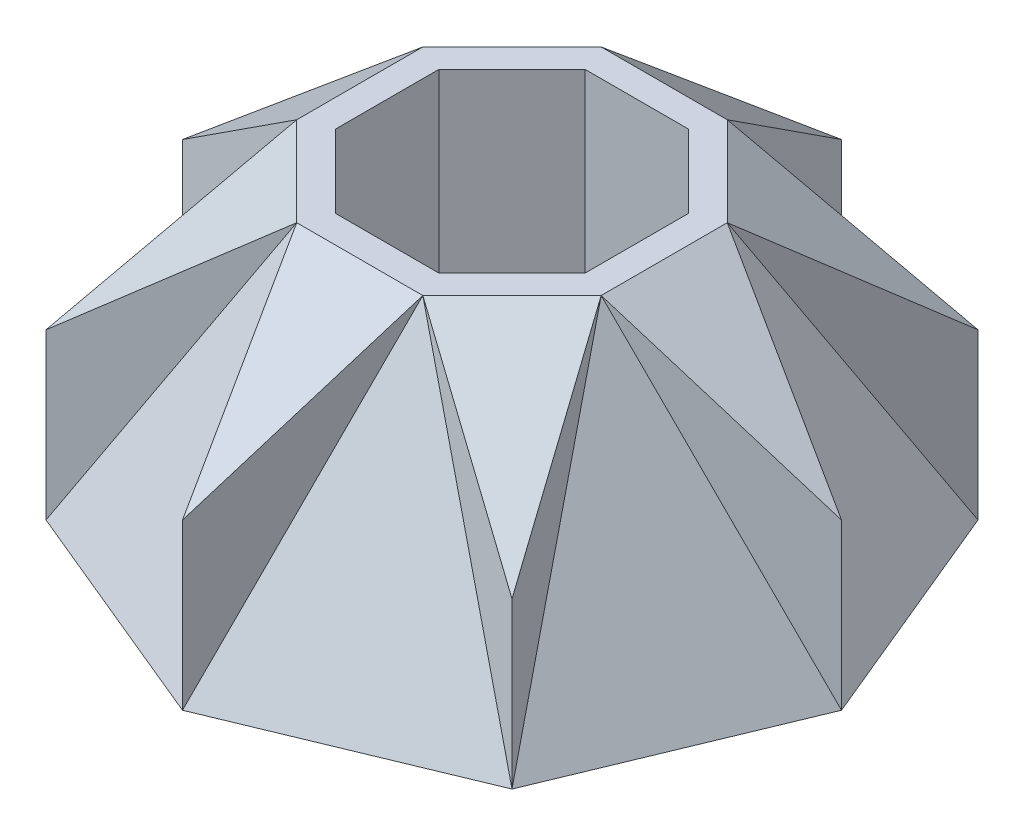
ISO-10303-21;
HEADER;
FILE_DESCRIPTION(('STEP AP214'),'2;1');
FILE_NAME('part.step','',(''),(''),'','','');
FILE_SCHEMA(('AUTOMOTIVE_DESIGN { 1 0 10303 214 1 1 1 1 }'));
ENDSEC;
DATA;
#1=APPLICATION_CONTEXT('core data for automotive mechanical design processes');
#2=APPLICATION_PROTOCOL_DEFINITION('international standard','automotive_design',2000,#1);
#3=PRODUCT_CONTEXT('',#1,'mechanical');
#4=PRODUCT('Part','Part','',(#3));
#5=PRODUCT_RELATED_PRODUCT_CATEGORY('part','',(#4));
#6=PRODUCT_DEFINITION_FORMATION('','',#4);
#7=PRODUCT_DEFINITION_CONTEXT('part definition',#1,'design');
#8=PRODUCT_DEFINITION('design','',#6,#7);
#9=PRODUCT_DEFINITION_SHAPE('','',#8);
#10=(LENGTH_UNIT() NAMED_UNIT(*) SI_UNIT(.MILLI.,.METRE.));
#11=(NAMED_UNIT(*) PLANE_ANGLE_UNIT() SI_UNIT($,.RADIAN.));
#12=(NAMED_UNIT(*) SI_UNIT($,.STERADIAN.) SOLID_ANGLE_UNIT());
#13=UNCERTAINTY_MEASURE_WITH_UNIT(LENGTH_MEASURE(1.E-05),#10,'distance_accuracy_value','');
#14=(GEOMETRIC_REPRESENTATION_CONTEXT(3) GLOBAL_UNCERTAINTY_ASSIGNED_CONTEXT((#13)) GLOBAL_UNIT_ASSIGNED_CONTEXT((#10,
#11,#12)) REPRESENTATION_CONTEXT('',''));
#15=CARTESIAN_POINT('',(0.,0.,0.));
#16=DIRECTION('',(0.,0.,1.));
#17=DIRECTION('',(1.,0.,0.));
#18=AXIS2_PLACEMENT_3D('',#15,#16,#17);
#19=CARTESIAN_POINT('',(0.,0.,0.));
#20=DIRECTION('',(0.,1.,0.));
#21=DIRECTION('',(0.,0.,1.));
#22=AXIS2_PLACEMENT_3D('',#19,#20,#21);
#23=PLANE('',#22);
#24=DIRECTION('',(1.,0.,0.));
#25=VECTOR('',#24,1.);
#26=CARTESIAN_POINT('',(11.4805029709524,0.,27.7163859753387));
#27=LINE('',#26,#25);
#28=CARTESIAN_POINT('',(-11.480502970953,0.,27.7163859753385));
#29=VERTEX_POINT('',#28);
#30=CARTESIAN_POINT('',(11.4805029709524,0.,27.7163859753387));
#31=VERTEX_POINT('',#30);
#32=EDGE_CURVE('E413',#29,#31,#27,.T.);
#33=ORIENTED_EDGE('',*,*,#32,.T.);
#34=DIRECTION('',(0.707106781186554,0.,-0.707106781186541));
#35=VECTOR('',#34,1.);
#36=CARTESIAN_POINT('',(27.7163859753385,0.,11.4805029709529));
#37=LINE('',#36,#35);
#38=CARTESIAN_POINT('',(27.7163859753386,0.,11.4805029709527));
#39=VERTEX_POINT('',#38);
#40=EDGE_CURVE('E337',#31,#39,#37,.T.);
#41=ORIENTED_EDGE('',*,*,#40,.T.);
#42=DIRECTION('',(0.,0.,-1.));
#43=VECTOR('',#42,1.);
#44=CARTESIAN_POINT('',(27.7163859753386,0.,-11.4805029709527));
#45=LINE('',#44,#43);
#46=CARTESIAN_POINT('',(27.7163859753386,0.,-11.4805029709525));
#47=VERTEX_POINT('',#46);
#48=EDGE_CURVE('E396',#39,#47,#45,.T.);
#49=ORIENTED_EDGE('',*,*,#48,.T.);
#50=DIRECTION('',(-0.707106781186544,0.,-0.707106781186551));
#51=VECTOR('',#50,1.);
#52=CARTESIAN_POINT('',(11.4805029709528,0.,-27.7163859753385));
#53=LINE('',#52,#51);
#54=CARTESIAN_POINT('',(11.4805029709528,0.,-27.7163859753385));
#55=VERTEX_POINT('',#54);
#56=EDGE_CURVE('E332',#47,#55,#53,.T.);
#57=ORIENTED_EDGE('',*,*,#56,.T.);
#58=DIRECTION('',(-1.,0.,0.));
#59=VECTOR('',#58,1.);
#60=CARTESIAN_POINT('',(-11.4805029709526,0.,-27.7163859753386));
#61=LINE('',#60,#59);
#62=CARTESIAN_POINT('',(-11.4805029709526,0.,-27.7163859753386));
#63=VERTEX_POINT('',#62);
#64=EDGE_CURVE('E347',#55,#63,#61,.T.);
#65=ORIENTED_EDGE('',*,*,#64,.T.);
#66=DIRECTION('',(-0.707106781186549,0.,0.707106781186546));
#67=VECTOR('',#66,1.);
#68=CARTESIAN_POINT('',(-27.7163859753386,0.,-11.4805029709527));
#69=LINE('',#68,#67);
#70=CARTESIAN_POINT('',(-27.7163859753386,0.,-11.4805029709527));
#71=VERTEX_POINT('',#70);
#72=EDGE_CURVE('E105',#63,#71,#69,.T.);
#73=ORIENTED_EDGE('',*,*,#72,.T.);
#74=DIRECTION('',(0.,0.,1.));
#75=VECTOR('',#74,1.);
#76=CARTESIAN_POINT('',(-27.7163859753386,0.,11.4805029709527));
#77=LINE('',#76,#75);
#78=CARTESIAN_POINT('',(-27.7163859753387,0.,11.4805029709524));
#79=VERTEX_POINT('',#78);
#80=EDGE_CURVE('E203',#71,#79,#77,.T.);
#81=ORIENTED_EDGE('',*,*,#80,.T.);
#82=DIRECTION('',(0.707106781186539,0.,0.707106781186556));
#83=VECTOR('',#82,1.);
#84=CARTESIAN_POINT('',(-11.480502970953,0.,27.7163859753384));
#85=LINE('',#84,#83);
#86=EDGE_CURVE('E342',#79,#29,#85,.T.);
#87=ORIENTED_EDGE('',*,*,#86,.T.);
#88=EDGE_LOOP('',(#33,#41,#49,#57,#65,#73,#81,#87));
#89=FACE_BOUND('',#88,.T.);
#90=DIRECTION('',(0.707106781186548,0.,0.707106781186548));
#91=VECTOR('',#90,1.);
#92=CARTESIAN_POINT('',(-16.0629105672129,0.,16.0629105672129));
#93=LINE('',#92,#91);
#94=CARTESIAN_POINT('',(-22.7163859753386,0.,9.40943515908722));
#95=VERTEX_POINT('',#94);
#96=CARTESIAN_POINT('',(-9.40943515908721,0.,22.7163859753386));
#97=VERTEX_POINT('',#96);
#98=EDGE_CURVE('E199',#95,#97,#93,.T.);
#99=ORIENTED_EDGE('',*,*,#98,.F.);
#100=DIRECTION('',(0.,0.,1.));
#101=VECTOR('',#100,1.);
#102=CARTESIAN_POINT('',(-22.7163859753386,0.,0.));
#103=LINE('',#102,#101);
#104=CARTESIAN_POINT('',(-22.7163859753386,0.,-9.40943515908721));
#105=VERTEX_POINT('',#104);
#106=EDGE_CURVE('E202',#105,#95,#103,.T.);
#107=ORIENTED_EDGE('',*,*,#106,.F.);
#108=DIRECTION('',(-0.707106781186548,0.,0.707106781186548));
#109=VECTOR('',#108,1.);
#110=CARTESIAN_POINT('',(-16.0629105672129,0.,-16.0629105672129));
#111=LINE('',#110,#109);
#112=CARTESIAN_POINT('',(-9.40943515908721,0.,-22.7163859753386));
#113=VERTEX_POINT('',#112);
#114=EDGE_CURVE('E205',#113,#105,#111,.T.);
#115=ORIENTED_EDGE('',*,*,#114,.F.);
#116=DIRECTION('',(-1.,0.,0.));
#117=VECTOR('',#116,1.);
#118=CARTESIAN_POINT('',(0.,0.,-22.7163859753386));
#119=LINE('',#118,#117);
#120=CARTESIAN_POINT('',(9.40943515908723,0.,-22.7163859753386));
#121=VERTEX_POINT('',#120);
#122=EDGE_CURVE('E207',#121,#113,#119,.T.);
#123=ORIENTED_EDGE('',*,*,#122,.F.);
#124=DIRECTION('',(-0.707106781186548,0.,-0.707106781186547));
#125=VECTOR('',#124,1.);
#126=CARTESIAN_POINT('',(16.0629105672129,0.,-16.0629105672129));
#127=LINE('',#126,#125);
#128=CARTESIAN_POINT('',(22.7163859753386,0.,-9.40943515908722));
#129=VERTEX_POINT('',#128);
#130=EDGE_CURVE('E209',#129,#121,#127,.T.);
#131=ORIENTED_EDGE('',*,*,#130,.F.);
#132=DIRECTION('',(0.,0.,-1.));
#133=VECTOR('',#132,1.);
#134=CARTESIAN_POINT('',(22.7163859753386,0.,0.));
#135=LINE('',#134,#133);
#136=CARTESIAN_POINT('',(22.7163859753386,0.,9.40943515908721));
#137=VERTEX_POINT('',#136);
#138=EDGE_CURVE('E211',#137,#129,#135,.T.);
#139=ORIENTED_EDGE('',*,*,#138,.F.);
#140=DIRECTION('',(0.707106781186548,0.,-0.707106781186548));
#141=VECTOR('',#140,1.);
#142=CARTESIAN_POINT('',(16.0629105672129,0.,16.0629105672129));
#143=LINE('',#142,#141);
#144=CARTESIAN_POINT('',(9.40943515908722,0.,22.7163859753386));
#145=VERTEX_POINT('',#144);
#146=EDGE_CURVE('E182',#145,#137,#143,.T.);
#147=ORIENTED_EDGE('',*,*,#146,.F.);
#148=DIRECTION('',(1.,0.,0.));
#149=VECTOR('',#148,1.);
#150=CARTESIAN_POINT('',(0.,0.,22.7163859753386));
#151=LINE('',#150,#149);
#152=EDGE_CURVE('E147',#97,#145,#151,.T.);
#153=ORIENTED_EDGE('',*,*,#152,.F.);
#154=EDGE_LOOP('',(#99,#107,#115,#123,#131,#139,#147,#153));
#155=FACE_BOUND('',#154,.T.);
#156=ADVANCED_FACE('F88',(#89,#155),#23,.T.);
#157=CARTESIAN_POINT('',(9.45810682098834,11.4286665506786,22.8338897616031));
#158=DIRECTION('',(0.347345206863505,0.419713228276339,0.838565509235148));
#159=DIRECTION('',(0.,-0.89424349333012,0.447580802354998));
#160=AXIS2_PLACEMENT_3D('',#157,#158,#159);
#161=PLANE('',#160);
#162=DIRECTION('',(0.177168388990801,0.848766070541331,-0.498204294883367));
#163=VECTOR('',#162,1.);
#164=CARTESIAN_POINT('',(13.5665615928986,9.99374543931796,21.850309240363));
#165=LINE('',#164,#163);
#166=CARTESIAN_POINT('',(-6.21527747087855E-13,-55.,59.9999999999999));
#167=VERTEX_POINT('',#166);
#168=EDGE_CURVE('E435',#167,#31,#165,.T.);
#169=ORIENTED_EDGE('',*,*,#168,.F.);
#170=DIRECTION('',(0.923879532511284,0.,-0.382683432365096));
#171=VECTOR('',#170,1.);
#172=CARTESIAN_POINT('',(21.2132034355967,-55.,51.2132034355963));
#173=LINE('',#172,#171);
#174=CARTESIAN_POINT('',(42.4264068711927,-55.,42.4264068711927));
#175=VERTEX_POINT('',#174);
#176=EDGE_CURVE('E215',#167,#175,#173,.T.);
#177=ORIENTED_EDGE('',*,*,#176,.T.);
#178=DIRECTION('',(0.477560604595568,-0.848766070541338,0.227006666061004));
#179=VECTOR('',#178,1.);
#180=CARTESIAN_POINT('',(5.85749413515997,9.99374543931783,25.0435095346075));
#181=LINE('',#180,#179);
#182=EDGE_CURVE('E469',#31,#175,#181,.T.);
#183=ORIENTED_EDGE('',*,*,#182,.F.);
#184=EDGE_LOOP('',(#169,#177,#183));
#185=FACE_BOUND('',#184,.T.);
#186=ADVANCED_FACE('F619',(#185),#161,.T.);
#187=CARTESIAN_POINT('',(-16.0629105672129,-55.,16.0629105672129));
#188=DIRECTION('',(-0.707106781186548,0.,0.707106781186548));
#189=DIRECTION('',(0.707106781186548,0.,0.707106781186548));
#190=AXIS2_PLACEMENT_3D('',#187,#188,#189);
#191=PLANE('',#190);
#192=ORIENTED_EDGE('',*,*,#98,.T.);
#193=DIRECTION('',(0.,1.,0.));
#194=VECTOR('',#193,1.);
#195=CARTESIAN_POINT('',(-9.40943515908721,-55.,22.7163859753386));
#196=LINE('',#195,#194);
#197=CARTESIAN_POINT('',(-9.40943515908721,-55.,22.7163859753386));
#198=VERTEX_POINT('',#197);
#199=EDGE_CURVE('E216',#198,#97,#196,.T.);
#200=ORIENTED_EDGE('',*,*,#199,.F.);
#201=DIRECTION('',(0.707106781186548,0.,0.707106781186548));
#202=VECTOR('',#201,1.);
#203=CARTESIAN_POINT('',(-16.0629105672129,-55.,16.0629105672129));
#204=LINE('',#203,#202);
#205=CARTESIAN_POINT('',(-22.7163859753386,-55.,9.40943515908722));
#206=VERTEX_POINT('',#205);
#207=EDGE_CURVE('E327',#206,#198,#204,.T.);
#208=ORIENTED_EDGE('',*,*,#207,.F.);
#209=DIRECTION('',(0.,1.,0.));
#210=VECTOR('',#209,1.);
#211=CARTESIAN_POINT('',(-22.7163859753386,-55.,9.40943515908722));
#212=LINE('',#211,#210);
#213=EDGE_CURVE('E198',#206,#95,#212,.T.);
#214=ORIENTED_EDGE('',*,*,#213,.T.);
#215=EDGE_LOOP('',(#192,#200,#208,#214));
#216=FACE_BOUND('',#215,.T.);
#217=ADVANCED_FACE('F90',(#216),#191,.F.);
#218=CARTESIAN_POINT('',(0.,-55.,22.7163859753386));
#219=DIRECTION('',(0.,0.,1.));
#220=DIRECTION('',(1.,0.,0.));
#221=AXIS2_PLACEMENT_3D('',#218,#219,#220);
#222=PLANE('',#221);
#223=ORIENTED_EDGE('',*,*,#152,.T.);
#224=DIRECTION('',(0.,1.,0.));
#225=VECTOR('',#224,1.);
#226=CARTESIAN_POINT('',(9.40943515908722,-55.,22.7163859753386));
#227=LINE('',#226,#225);
#228=CARTESIAN_POINT('',(9.40943515908722,-55.,22.7163859753386));
#229=VERTEX_POINT('',#228);
#230=EDGE_CURVE('E185',#229,#145,#227,.T.);
#231=ORIENTED_EDGE('',*,*,#230,.F.);
#232=DIRECTION('',(1.,0.,0.));
#233=VECTOR('',#232,1.);
#234=CARTESIAN_POINT('',(0.,-55.,22.7163859753386));
#235=LINE('',#234,#233);
#236=EDGE_CURVE('E114',#198,#229,#235,.T.);
#237=ORIENTED_EDGE('',*,*,#236,.F.);
#238=ORIENTED_EDGE('',*,*,#199,.T.);
#239=EDGE_LOOP('',(#223,#231,#237,#238));
#240=FACE_BOUND('',#239,.T.);
#241=ADVANCED_FACE('F628',(#240),#222,.F.);
#242=CARTESIAN_POINT('',(16.0629105672129,-55.,16.0629105672129));
#243=DIRECTION('',(0.707106781186548,0.,0.707106781186548));
#244=DIRECTION('',(0.707106781186548,0.,-0.707106781186548));
#245=AXIS2_PLACEMENT_3D('',#242,#243,#244);
#246=PLANE('',#245);
#247=ORIENTED_EDGE('',*,*,#146,.T.);
#248=DIRECTION('',(0.,1.,0.));
#249=VECTOR('',#248,1.);
#250=CARTESIAN_POINT('',(22.7163859753386,-55.,9.40943515908721));
#251=LINE('',#250,#249);
#252=CARTESIAN_POINT('',(22.7163859753386,-55.,9.40943515908721));
#253=VERTEX_POINT('',#252);
#254=EDGE_CURVE('E180',#253,#137,#251,.T.);
#255=ORIENTED_EDGE('',*,*,#254,.F.);
#256=DIRECTION('',(0.707106781186548,0.,-0.707106781186548));
#257=VECTOR('',#256,1.);
#258=CARTESIAN_POINT('',(16.0629105672129,-55.,16.0629105672129));
#259=LINE('',#258,#257);
#260=EDGE_CURVE('E170',#229,#253,#259,.T.);
#261=ORIENTED_EDGE('',*,*,#260,.F.);
#262=ORIENTED_EDGE('',*,*,#230,.T.);
#263=EDGE_LOOP('',(#247,#255,#261,#262));
#264=FACE_BOUND('',#263,.T.);
#265=ADVANCED_FACE('F181',(#264),#246,.F.);
#266=CARTESIAN_POINT('',(22.7163859753386,-55.,0.));
#267=DIRECTION('',(1.,0.,0.));
#268=DIRECTION('',(0.,0.,-1.));
#269=AXIS2_PLACEMENT_3D('',#266,#267,#268);
#270=PLANE('',#269);
#271=ORIENTED_EDGE('',*,*,#138,.T.);
#272=DIRECTION('',(0.,1.,0.));
#273=VECTOR('',#272,1.);
#274=CARTESIAN_POINT('',(22.7163859753386,-55.,-9.40943515908722));
#275=LINE('',#274,#273);
#276=CARTESIAN_POINT('',(22.7163859753386,-55.,-9.40943515908722));
#277=VERTEX_POINT('',#276);
#278=EDGE_CURVE('E186',#277,#129,#275,.T.);
#279=ORIENTED_EDGE('',*,*,#278,.F.);
#280=DIRECTION('',(0.,0.,-1.));
#281=VECTOR('',#280,1.);
#282=CARTESIAN_POINT('',(22.7163859753386,-55.,0.));
#283=LINE('',#282,#281);
#284=EDGE_CURVE('E174',#253,#277,#283,.T.);
#285=ORIENTED_EDGE('',*,*,#284,.F.);
#286=ORIENTED_EDGE('',*,*,#254,.T.);
#287=EDGE_LOOP('',(#271,#279,#285,#286));
#288=FACE_BOUND('',#287,.T.);
#289=ADVANCED_FACE('F188',(#288),#270,.F.);
#290=CARTESIAN_POINT('',(16.0629105672129,-55.,-16.0629105672129));
#291=DIRECTION('',(0.707106781186547,0.,-0.707106781186548));
#292=DIRECTION('',(-0.707106781186548,0.,-0.707106781186547));
#293=AXIS2_PLACEMENT_3D('',#290,#291,#292);
#294=PLANE('',#293);
#295=ORIENTED_EDGE('',*,*,#130,.T.);
#296=DIRECTION('',(0.,1.,0.));
#297=VECTOR('',#296,1.);
#298=CARTESIAN_POINT('',(9.40943515908723,-55.,-22.7163859753386));
#299=LINE('',#298,#297);
#300=CARTESIAN_POINT('',(9.40943515908723,-55.,-22.7163859753386));
#301=VERTEX_POINT('',#300);
#302=EDGE_CURVE('E221',#301,#121,#299,.T.);
#303=ORIENTED_EDGE('',*,*,#302,.F.);
#304=DIRECTION('',(-0.707106781186548,0.,-0.707106781186547));
#305=VECTOR('',#304,1.);
#306=CARTESIAN_POINT('',(16.0629105672129,-55.,-16.0629105672129));
#307=LINE('',#306,#305);
#308=EDGE_CURVE('E191',#277,#301,#307,.T.);
#309=ORIENTED_EDGE('',*,*,#308,.F.);
#310=ORIENTED_EDGE('',*,*,#278,.T.);
#311=EDGE_LOOP('',(#295,#303,#309,#310));
#312=FACE_BOUND('',#311,.T.);
#313=ADVANCED_FACE('F635',(#312),#294,.F.);
#314=CARTESIAN_POINT('',(0.,-55.,-22.7163859753386));
#315=DIRECTION('',(0.,0.,-1.));
#316=DIRECTION('',(-1.,0.,0.));
#317=AXIS2_PLACEMENT_3D('',#314,#315,#316);
#318=PLANE('',#317);
#319=ORIENTED_EDGE('',*,*,#122,.T.);
#320=DIRECTION('',(0.,1.,0.));
#321=VECTOR('',#320,1.);
#322=CARTESIAN_POINT('',(-9.40943515908721,-55.,-22.7163859753386));
#323=LINE('',#322,#321);
#324=CARTESIAN_POINT('',(-9.40943515908721,-55.,-22.7163859753386));
#325=VERTEX_POINT('',#324);
#326=EDGE_CURVE('E224',#325,#113,#323,.T.);
#327=ORIENTED_EDGE('',*,*,#326,.F.);
#328=DIRECTION('',(-1.,0.,0.));
#329=VECTOR('',#328,1.);
#330=CARTESIAN_POINT('',(0.,-55.,-22.7163859753386));
#331=LINE('',#330,#329);
#332=EDGE_CURVE('E193',#301,#325,#331,.T.);
#333=ORIENTED_EDGE('',*,*,#332,.F.);
#334=ORIENTED_EDGE('',*,*,#302,.T.);
#335=EDGE_LOOP('',(#319,#327,#333,#334));
#336=FACE_BOUND('',#335,.T.);
#337=ADVANCED_FACE('F638',(#336),#318,.F.);
#338=CARTESIAN_POINT('',(-16.0629105672129,-55.,-16.0629105672129));
#339=DIRECTION('',(-0.707106781186548,0.,-0.707106781186548));
#340=DIRECTION('',(-0.707106781186548,0.,0.707106781186548));
#341=AXIS2_PLACEMENT_3D('',#338,#339,#340);
#342=PLANE('',#341);
#343=ORIENTED_EDGE('',*,*,#114,.T.);
#344=DIRECTION('',(0.,1.,0.));
#345=VECTOR('',#344,1.);
#346=CARTESIAN_POINT('',(-22.7163859753386,-55.,-9.40943515908721));
#347=LINE('',#346,#345);
#348=CARTESIAN_POINT('',(-22.7163859753386,-55.,-9.40943515908721));
#349=VERTEX_POINT('',#348);
#350=EDGE_CURVE('E227',#349,#105,#347,.T.);
#351=ORIENTED_EDGE('',*,*,#350,.F.);
#352=DIRECTION('',(-0.707106781186548,0.,0.707106781186548));
#353=VECTOR('',#352,1.);
#354=CARTESIAN_POINT('',(-16.0629105672129,-55.,-16.0629105672129));
#355=LINE('',#354,#353);
#356=EDGE_CURVE('E661',#325,#349,#355,.T.);
#357=ORIENTED_EDGE('',*,*,#356,.F.);
#358=ORIENTED_EDGE('',*,*,#326,.T.);
#359=EDGE_LOOP('',(#343,#351,#357,#358));
#360=FACE_BOUND('',#359,.T.);
#361=ADVANCED_FACE('F642',(#360),#342,.F.);
#362=CARTESIAN_POINT('',(-22.7163859753386,-55.,0.));
#363=DIRECTION('',(-1.,0.,0.));
#364=DIRECTION('',(0.,0.,1.));
#365=AXIS2_PLACEMENT_3D('',#362,#363,#364);
#366=PLANE('',#365);
#367=ORIENTED_EDGE('',*,*,#106,.T.);
#368=ORIENTED_EDGE('',*,*,#213,.F.);
#369=DIRECTION('',(0.,0.,1.));
#370=VECTOR('',#369,1.);
#371=CARTESIAN_POINT('',(-22.7163859753386,-55.,0.));
#372=LINE('',#371,#370);
#373=EDGE_CURVE('E154',#349,#206,#372,.T.);
#374=ORIENTED_EDGE('',*,*,#373,.F.);
#375=ORIENTED_EDGE('',*,*,#350,.T.);
#376=EDGE_LOOP('',(#367,#368,#374,#375));
#377=FACE_BOUND('',#376,.T.);
#378=ADVANCED_FACE('F645',(#377),#366,.F.);
#379=CARTESIAN_POINT('',(0.,-55.,0.));
#380=DIRECTION('',(0.,1.,0.));
#381=DIRECTION('',(0.,0.,1.));
#382=AXIS2_PLACEMENT_3D('',#379,#380,#381);
#383=PLANE('',#382);
#384=DIRECTION('',(0.923879532511289,0.,0.382683432365084));
#385=VECTOR('',#384,1.);
#386=CARTESIAN_POINT('',(-21.2132034355961,-55.,51.2132034355965));
#387=LINE('',#386,#385);
#388=CARTESIAN_POINT('',(-42.4264068711927,-55.,42.426406871193));
#389=VERTEX_POINT('',#388);
#390=EDGE_CURVE('E241',#389,#167,#387,.T.);
#391=ORIENTED_EDGE('',*,*,#390,.F.);
#392=DIRECTION('',(0.382683432365091,0.,0.923879532511286));
#393=VECTOR('',#392,1.);
#394=CARTESIAN_POINT('',(-51.2132034355963,-55.,21.2132034355964));
#395=LINE('',#394,#393);
#396=CARTESIAN_POINT('',(-59.9999999999999,-55.,0.));
#397=VERTEX_POINT('',#396);
#398=EDGE_CURVE('E235',#397,#389,#395,.T.);
#399=ORIENTED_EDGE('',*,*,#398,.F.);
#400=DIRECTION('',(-0.382683432365088,0.,0.923879532511288));
#401=VECTOR('',#400,1.);
#402=CARTESIAN_POINT('',(-51.2132034355964,-55.,-21.2132034355963));
#403=LINE('',#402,#401);
#404=CARTESIAN_POINT('',(-42.4264068711927,-55.,-42.4264068711928));
#405=VERTEX_POINT('',#404);
#406=EDGE_CURVE('E232',#405,#397,#403,.T.);
#407=ORIENTED_EDGE('',*,*,#406,.F.);
#408=DIRECTION('',(-0.923879532511287,0.,0.38268343236509));
#409=VECTOR('',#408,1.);
#410=CARTESIAN_POINT('',(-21.2132034355964,-55.,-51.2132034355964));
#411=LINE('',#410,#409);
#412=CARTESIAN_POINT('',(-1.10384930073772E-13,-55.,-60.0000000000001));
#413=VERTEX_POINT('',#412);
#414=EDGE_CURVE('E236',#413,#405,#411,.T.);
#415=ORIENTED_EDGE('',*,*,#414,.F.);
#416=DIRECTION('',(-0.923879532511287,0.,-0.38268343236509));
#417=VECTOR('',#416,1.);
#418=CARTESIAN_POINT('',(21.2132034355964,-55.,-51.2132034355964));
#419=LINE('',#418,#417);
#420=CARTESIAN_POINT('',(42.426406871193,-55.,-42.4264068711925));
#421=VERTEX_POINT('',#420);
#422=EDGE_CURVE('E294',#421,#413,#419,.T.);
#423=ORIENTED_EDGE('',*,*,#422,.F.);
#424=DIRECTION('',(-0.382683432365087,0.,-0.923879532511288));
#425=VECTOR('',#424,1.);
#426=CARTESIAN_POINT('',(51.2132034355964,-55.,-21.2132034355963));
#427=LINE('',#426,#425);
#428=CARTESIAN_POINT('',(59.9999999999999,-55.,0.));
#429=VERTEX_POINT('',#428);
#430=EDGE_CURVE('E299',#429,#421,#427,.T.);
#431=ORIENTED_EDGE('',*,*,#430,.F.);
#432=DIRECTION('',(0.382683432365085,0.,-0.923879532511289));
#433=VECTOR('',#432,1.);
#434=CARTESIAN_POINT('',(51.2132034355966,-55.,21.2132034355962));
#435=LINE('',#434,#433);
#436=EDGE_CURVE('E308',#175,#429,#435,.T.);
#437=ORIENTED_EDGE('',*,*,#436,.F.);
#438=ORIENTED_EDGE('',*,*,#176,.F.);
#439=EDGE_LOOP('',(#391,#399,#407,#415,#423,#431,#437,#438));
#440=FACE_BOUND('',#439,.T.);
#441=ORIENTED_EDGE('',*,*,#207,.T.);
#442=ORIENTED_EDGE('',*,*,#236,.T.);
#443=ORIENTED_EDGE('',*,*,#260,.T.);
#444=ORIENTED_EDGE('',*,*,#284,.T.);
#445=ORIENTED_EDGE('',*,*,#308,.T.);
#446=ORIENTED_EDGE('',*,*,#332,.T.);
#447=ORIENTED_EDGE('',*,*,#356,.T.);
#448=ORIENTED_EDGE('',*,*,#373,.T.);
#449=EDGE_LOOP('',(#441,#442,#443,#444,#445,#446,#447,#448));
#450=FACE_BOUND('',#449,.T.);
#451=ADVANCED_FACE('F172',(#440,#450),#383,.F.);
#452=CARTESIAN_POINT('',(-22.8338897616032,11.4286665506786,9.45810682098826));
#453=DIRECTION('',(-0.838565509235149,0.419713228276339,0.347345206863502));
#454=DIRECTION('',(-0.447580802354998,-0.89424349333012,0.));
#455=AXIS2_PLACEMENT_3D('',#452,#453,#454);
#456=PLANE('',#455);
#457=DIRECTION('',(-0.227006666061006,-0.848766070541338,0.477560604595567));
#458=VECTOR('',#457,1.);
#459=CARTESIAN_POINT('',(-25.0435095346076,9.99374543931783,5.85749413515988));
#460=LINE('',#459,#458);
#461=EDGE_CURVE('E445',#79,#389,#460,.T.);
#462=ORIENTED_EDGE('',*,*,#461,.F.);
#463=DIRECTION('',(0.498204294883364,0.848766070541334,0.177168388990794));
#464=VECTOR('',#463,1.);
#465=CARTESIAN_POINT('',(-21.850309240363,9.9937454393179,13.5665615928988));
#466=LINE('',#465,#464);
#467=EDGE_CURVE('E365',#397,#79,#466,.T.);
#468=ORIENTED_EDGE('',*,*,#467,.F.);
#469=ORIENTED_EDGE('',*,*,#398,.T.);
#470=EDGE_LOOP('',(#462,#468,#469));
#471=FACE_BOUND('',#470,.T.);
#472=ADVANCED_FACE('F652',(#471),#456,.T.);
#473=CARTESIAN_POINT('',(9.45810682098825,11.4286665506786,-22.8338897616032));
#474=DIRECTION('',(0.347345206863502,0.419713228276339,-0.838565509235149));
#475=DIRECTION('',(0.316487420474138,-0.89424349333012,-0.316487420474132));
#476=AXIS2_PLACEMENT_3D('',#473,#474,#475);
#477=PLANE('',#476);
#478=DIRECTION('',(-0.477560604595577,0.848766070541334,0.227006666061));
#479=VECTOR('',#478,1.);
#480=CARTESIAN_POINT('',(5.85749413516018,9.9937454393179,-25.0435095346074));
#481=LINE('',#480,#479);
#482=EDGE_CURVE('E490',#421,#55,#481,.T.);
#483=ORIENTED_EDGE('',*,*,#482,.F.);
#484=ORIENTED_EDGE('',*,*,#422,.T.);
#485=DIRECTION('',(-0.177168388990792,-0.848766070541335,-0.498204294883363));
#486=VECTOR('',#485,1.);
#487=CARTESIAN_POINT('',(13.5665615928988,9.99374543931789,-21.850309240363));
#488=LINE('',#487,#486);
#489=EDGE_CURVE('E502',#55,#413,#488,.T.);
#490=ORIENTED_EDGE('',*,*,#489,.F.);
#491=EDGE_LOOP('',(#483,#484,#490));
#492=FACE_BOUND('',#491,.T.);
#493=ADVANCED_FACE('F744',(#492),#477,.T.);
#494=CARTESIAN_POINT('',(-22.8338897616032,11.4286665506786,-9.45810682098817));
#495=DIRECTION('',(-0.83856550923515,0.419713228276339,-0.347345206863499));
#496=DIRECTION('',(-0.316487420474133,-0.89424349333012,-0.316487420474137));
#497=AXIS2_PLACEMENT_3D('',#494,#495,#496);
#498=PLANE('',#497);
#499=DIRECTION('',(0.227006666061002,0.848766070541334,0.477560604595576));
#500=VECTOR('',#499,1.);
#501=CARTESIAN_POINT('',(-25.0435095346074,9.9937454393179,-5.85749413516009));
#502=LINE('',#501,#500);
#503=EDGE_CURVE('E386',#405,#71,#502,.T.);
#504=ORIENTED_EDGE('',*,*,#503,.F.);
#505=ORIENTED_EDGE('',*,*,#406,.T.);
#506=DIRECTION('',(-0.498204294883363,-0.848766070541335,0.177168388990794));
#507=VECTOR('',#506,1.);
#508=CARTESIAN_POINT('',(-21.850309240363,9.99374543931789,-13.5665615928987));
#509=LINE('',#508,#507);
#510=EDGE_CURVE('E245',#71,#397,#509,.T.);
#511=ORIENTED_EDGE('',*,*,#510,.F.);
#512=EDGE_LOOP('',(#504,#505,#511));
#513=FACE_BOUND('',#512,.T.);
#514=ADVANCED_FACE('F790',(#513),#498,.T.);
#515=CARTESIAN_POINT('',(-9.45810682098834,11.4286665506786,-22.8338897616031));
#516=DIRECTION('',(-0.347345206863505,0.419713228276339,-0.838565509235148));
#517=DIRECTION('',(0.,-0.89424349333012,-0.447580802354998));
#518=AXIS2_PLACEMENT_3D('',#515,#516,#517);
#519=PLANE('',#518);
#520=DIRECTION('',(-0.177168388990797,0.848766070541333,0.498204294883366));
#521=VECTOR('',#520,1.);
#522=CARTESIAN_POINT('',(-13.5665615928987,9.99374543931793,-21.850309240363));
#523=LINE('',#522,#521);
#524=EDGE_CURVE('E402',#413,#63,#523,.T.);
#525=ORIENTED_EDGE('',*,*,#524,.F.);
#526=ORIENTED_EDGE('',*,*,#414,.T.);
#527=DIRECTION('',(-0.477560604595572,-0.848766070541336,-0.227006666061002));
#528=VECTOR('',#527,1.);
#529=CARTESIAN_POINT('',(-5.85749413516009,9.99374543931786,-25.0435095346075));
#530=LINE('',#529,#528);
#531=EDGE_CURVE('E218',#63,#405,#530,.T.);
#532=ORIENTED_EDGE('',*,*,#531,.F.);
#533=EDGE_LOOP('',(#525,#526,#532));
#534=FACE_BOUND('',#533,.T.);
#535=ADVANCED_FACE('F736',(#534),#519,.T.);
#536=CARTESIAN_POINT('',(22.8338897616032,11.4286665506786,-9.4581068209881));
#537=DIRECTION('',(0.838565509235152,0.419713228276339,-0.347345206863497));
#538=DIRECTION('',(0.447580802354998,-0.89424349333012,0.));
#539=AXIS2_PLACEMENT_3D('',#536,#537,#538);
#540=PLANE('',#539);
#541=DIRECTION('',(-0.498204294883362,0.848766070541335,-0.177168388990793));
#542=VECTOR('',#541,1.);
#543=CARTESIAN_POINT('',(21.850309240363,9.99374543931787,-13.5665615928987));
#544=LINE('',#543,#542);
#545=EDGE_CURVE('E419',#429,#47,#544,.T.);
#546=ORIENTED_EDGE('',*,*,#545,.F.);
#547=ORIENTED_EDGE('',*,*,#430,.T.);
#548=DIRECTION('',(0.227006666061004,-0.848766070541335,-0.477560604595573));
#549=VECTOR('',#548,1.);
#550=CARTESIAN_POINT('',(25.0435095346075,9.99374543931789,-5.85749413515995));
#551=LINE('',#550,#549);
#552=EDGE_CURVE('E289',#47,#421,#551,.T.);
#553=ORIENTED_EDGE('',*,*,#552,.F.);
#554=EDGE_LOOP('',(#546,#547,#553));
#555=FACE_BOUND('',#554,.T.);
#556=ADVANCED_FACE('F758',(#555),#540,.T.);
#557=CARTESIAN_POINT('',(22.8338897616031,11.4286665506786,9.45810682098833));
#558=DIRECTION('',(0.838565509235148,0.419713228276339,0.347345206863505));
#559=DIRECTION('',(0.316487420474131,-0.89424349333012,0.316487420474139));
#560=AXIS2_PLACEMENT_3D('',#557,#558,#559);
#561=PLANE('',#560);
#562=DIRECTION('',(-0.227006666060998,0.848766070541334,-0.477560604595578));
#563=VECTOR('',#562,1.);
#564=CARTESIAN_POINT('',(25.0435095346074,9.9937454393179,5.85749413516027));
#565=LINE('',#564,#563);
#566=EDGE_CURVE('E466',#175,#39,#565,.T.);
#567=ORIENTED_EDGE('',*,*,#566,.F.);
#568=ORIENTED_EDGE('',*,*,#436,.T.);
#569=DIRECTION('',(0.498204294883365,-0.848766070541333,-0.177168388990795));
#570=VECTOR('',#569,1.);
#571=CARTESIAN_POINT('',(21.850309240363,9.99374543931792,13.5665615928988));
#572=LINE('',#571,#570);
#573=EDGE_CURVE('E97',#39,#429,#572,.T.);
#574=ORIENTED_EDGE('',*,*,#573,.F.);
#575=EDGE_LOOP('',(#567,#568,#574));
#576=FACE_BOUND('',#575,.T.);
#577=ADVANCED_FACE('F276',(#576),#561,.T.);
#578=CARTESIAN_POINT('',(-9.45810682098809,11.4286665506786,22.8338897616032));
#579=DIRECTION('',(-0.347345206863496,0.419713228276339,0.838565509235152));
#580=DIRECTION('',(-0.316487420474135,-0.89424349333012,0.316487420474134));
#581=AXIS2_PLACEMENT_3D('',#578,#579,#580);
#582=PLANE('',#581);
#583=DIRECTION('',(0.477560604595583,0.848766070541331,-0.227006666060999));
#584=VECTOR('',#583,1.);
#585=CARTESIAN_POINT('',(-5.85749413516026,9.99374543931796,25.0435095346073));
#586=LINE('',#585,#584);
#587=EDGE_CURVE('E353',#389,#29,#586,.T.);
#588=ORIENTED_EDGE('',*,*,#587,.F.);
#589=ORIENTED_EDGE('',*,*,#390,.T.);
#590=DIRECTION('',(0.177168388990787,-0.848766070541338,0.49820429488336));
#591=VECTOR('',#590,1.);
#592=CARTESIAN_POINT('',(-13.5665615928989,9.99374543931783,21.850309240363));
#593=LINE('',#592,#591);
#594=EDGE_CURVE('E12',#29,#167,#593,.T.);
#595=ORIENTED_EDGE('',*,*,#594,.F.);
#596=EDGE_LOOP('',(#588,#589,#595));
#597=FACE_BOUND('',#596,.T.);
#598=ADVANCED_FACE('F272',(#597),#582,.T.);
#599=CARTESIAN_POINT('',(-10.3901220665352,13.4172276186055,0.));
#600=DIRECTION('',(0.612268652496695,-0.790649794264111,0.));
#601=DIRECTION('',(0.790649794264111,0.612268652496695,0.));
#602=AXIS2_PLACEMENT_3D('',#599,#600,#601);
#603=PLANE('',#602);
#604=DIRECTION('',(-0.761136412663838,-0.589413883528041,-0.270670713638577));
#605=VECTOR('',#604,1.);
#606=CARTESIAN_POINT('',(-59.9999999999999,-25.,0.));
#607=LINE('',#606,#605);
#608=CARTESIAN_POINT('',(-59.9999999999999,-25.,0.));
#609=VERTEX_POINT('',#608);
#610=EDGE_CURVE('E361',#79,#609,#607,.T.);
#611=ORIENTED_EDGE('',*,*,#610,.F.);
#612=ORIENTED_EDGE('',*,*,#80,.F.);
#613=DIRECTION('',(0.761136412663837,0.589413883528041,-0.270670713638579));
#614=VECTOR('',#613,1.);
#615=CARTESIAN_POINT('',(-27.7163859753386,0.,-11.4805029709527));
#616=LINE('',#615,#614);
#617=EDGE_CURVE('E255',#609,#71,#616,.T.);
#618=ORIENTED_EDGE('',*,*,#617,.F.);
#619=EDGE_LOOP('',(#611,#612,#618));
#620=FACE_BOUND('',#619,.T.);
#621=ADVANCED_FACE('F261',(#620),#603,.F.);
#622=CARTESIAN_POINT('',(-6.73585180965965,0.,-18.9414732525715));
#623=DIRECTION('',(-0.335058497620432,0.,-0.942197327088301));
#624=DIRECTION('',(-0.942197327088301,0.,0.335058497620432));
#625=AXIS2_PLACEMENT_3D('',#622,#623,#624);
#626=PLANE('',#625);
#627=ORIENTED_EDGE('',*,*,#617,.T.);
#628=ORIENTED_EDGE('',*,*,#510,.T.);
#629=DIRECTION('',(0.,1.,0.));
#630=VECTOR('',#629,1.);
#631=CARTESIAN_POINT('',(-59.9999999999999,-55.,0.));
#632=LINE('',#631,#630);
#633=EDGE_CURVE('E380',#397,#609,#632,.T.);
#634=ORIENTED_EDGE('',*,*,#633,.T.);
#635=EDGE_LOOP('',(#627,#628,#634));
#636=FACE_BOUND('',#635,.T.);
#637=ADVANCED_FACE('F271',(#636),#626,.T.);
#638=CARTESIAN_POINT('',(-6.73585180965965,0.,18.9414732525715));
#639=DIRECTION('',(-0.335058497620432,0.,0.942197327088301));
#640=DIRECTION('',(0.942197327088301,0.,0.335058497620432));
#641=AXIS2_PLACEMENT_3D('',#638,#639,#640);
#642=PLANE('',#641);
#643=ORIENTED_EDGE('',*,*,#633,.F.);
#644=ORIENTED_EDGE('',*,*,#467,.T.);
#645=ORIENTED_EDGE('',*,*,#610,.T.);
#646=EDGE_LOOP('',(#643,#644,#645));
#647=FACE_BOUND('',#646,.T.);
#648=ADVANCED_FACE('F273',(#647),#642,.T.);
#649=CARTESIAN_POINT('',(-7.34692577060299,13.4172276186055,-7.34692577060301));
#650=DIRECTION('',(0.432939316088362,-0.790649794264111,0.432939316088364));
#651=DIRECTION('',(0.559073831067901,0.612268652496695,0.559073831067903));
#652=AXIS2_PLACEMENT_3D('',#649,#650,#651);
#653=PLANE('',#652);
#654=DIRECTION('',(-0.346811621720161,-0.589413883528041,-0.729597815885043));
#655=VECTOR('',#654,1.);
#656=CARTESIAN_POINT('',(-42.4264068711927,-25.,-42.4264068711928));
#657=LINE('',#656,#655);
#658=CARTESIAN_POINT('',(-42.4264068711927,-25.,-42.4264068711928));
#659=VERTEX_POINT('',#658);
#660=EDGE_CURVE('E383',#71,#659,#657,.T.);
#661=ORIENTED_EDGE('',*,*,#660,.F.);
#662=ORIENTED_EDGE('',*,*,#72,.F.);
#663=DIRECTION('',(0.729597815885042,0.589413883528041,0.346811621720162));
#664=VECTOR('',#663,1.);
#665=CARTESIAN_POINT('',(-11.4805029709526,0.,-27.7163859753386));
#666=LINE('',#665,#664);
#667=EDGE_CURVE('E387',#659,#63,#666,.T.);
#668=ORIENTED_EDGE('',*,*,#667,.F.);
#669=EDGE_LOOP('',(#661,#662,#668));
#670=FACE_BOUND('',#669,.T.);
#671=ADVANCED_FACE('F534',(#670),#653,.F.);
#672=CARTESIAN_POINT('',(8.63067769087896,0.,-18.1566106742349));
#673=DIRECTION('',(0.429311983438395,0.,-0.903156254961561));
#674=DIRECTION('',(-0.903156254961561,0.,-0.429311983438395));
#675=AXIS2_PLACEMENT_3D('',#672,#673,#674);
#676=PLANE('',#675);
#677=ORIENTED_EDGE('',*,*,#667,.T.);
#678=ORIENTED_EDGE('',*,*,#531,.T.);
#679=DIRECTION('',(0.,1.,0.));
#680=VECTOR('',#679,1.);
#681=CARTESIAN_POINT('',(-42.4264068711927,-55.,-42.4264068711928));
#682=LINE('',#681,#680);
#683=EDGE_CURVE('E392',#405,#659,#682,.T.);
#684=ORIENTED_EDGE('',*,*,#683,.T.);
#685=EDGE_LOOP('',(#677,#678,#684));
#686=FACE_BOUND('',#685,.T.);
#687=ADVANCED_FACE('F537',(#686),#676,.T.);
#688=CARTESIAN_POINT('',(-18.156610674235,0.,8.6306776908789));
#689=DIRECTION('',(-0.903156254961562,0.,0.429311983438392));
#690=DIRECTION('',(0.429311983438392,0.,0.903156254961562));
#691=AXIS2_PLACEMENT_3D('',#688,#689,#690);
#692=PLANE('',#691);
#693=ORIENTED_EDGE('',*,*,#683,.F.);
#694=ORIENTED_EDGE('',*,*,#503,.T.);
#695=ORIENTED_EDGE('',*,*,#660,.T.);
#696=EDGE_LOOP('',(#693,#694,#695));
#697=FACE_BOUND('',#696,.T.);
#698=ADVANCED_FACE('F539',(#697),#692,.T.);
#699=CARTESIAN_POINT('',(0.,13.4172276186055,-10.3901220665352));
#700=DIRECTION('',(0.,-0.790649794264111,0.612268652496695));
#701=DIRECTION('',(0.,0.612268652496695,0.790649794264111));
#702=AXIS2_PLACEMENT_3D('',#699,#700,#701);
#703=PLANE('',#702);
#704=ORIENTED_EDGE('',*,*,#64,.F.);
#705=DIRECTION('',(0.270670713638576,0.589413883528041,0.761136412663838));
#706=VECTOR('',#705,1.);
#707=CARTESIAN_POINT('',(11.4805029709528,0.,-27.7163859753385));
#708=LINE('',#707,#706);
#709=CARTESIAN_POINT('',(2.07754156854611E-13,-25.,-59.9999999999999));
#710=VERTEX_POINT('',#709);
#711=EDGE_CURVE('E403',#710,#55,#708,.T.);
#712=ORIENTED_EDGE('',*,*,#711,.F.);
#713=DIRECTION('',(0.27067071363858,-0.589413883528041,-0.761136412663837));
#714=VECTOR('',#713,1.);
#715=CARTESIAN_POINT('',(2.0254998642668E-13,-25.,-59.9999999999999));
#716=LINE('',#715,#714);
#717=EDGE_CURVE('E399',#63,#710,#716,.T.);
#718=ORIENTED_EDGE('',*,*,#717,.F.);
#719=EDGE_LOOP('',(#704,#712,#718));
#720=FACE_BOUND('',#719,.T.);
#721=ADVANCED_FACE('F542',(#720),#703,.F.);
#722=CARTESIAN_POINT('',(18.9414732525716,0.,-6.73585180965958));
#723=DIRECTION('',(0.942197327088302,0.,-0.335058497620429));
#724=DIRECTION('',(-0.335058497620429,0.,-0.942197327088302));
#725=AXIS2_PLACEMENT_3D('',#722,#723,#724);
#726=PLANE('',#725);
#727=ORIENTED_EDGE('',*,*,#711,.T.);
#728=ORIENTED_EDGE('',*,*,#489,.T.);
#729=DIRECTION('',(0.,1.,0.));
#730=VECTOR('',#729,1.);
#731=CARTESIAN_POINT('',(2.0254998642668E-13,-55.,-59.9999999999999));
#732=LINE('',#731,#730);
#733=EDGE_CURVE('E408',#413,#710,#732,.T.);
#734=ORIENTED_EDGE('',*,*,#733,.T.);
#735=EDGE_LOOP('',(#727,#728,#734));
#736=FACE_BOUND('',#735,.T.);
#737=ADVANCED_FACE('F549',(#736),#726,.T.);
#738=CARTESIAN_POINT('',(-18.9414732525715,0.,-6.73585180965971));
#739=DIRECTION('',(-0.9421973270883,0.,-0.335058497620435));
#740=DIRECTION('',(-0.335058497620435,0.,0.9421973270883));
#741=AXIS2_PLACEMENT_3D('',#738,#739,#740);
#742=PLANE('',#741);
#743=ORIENTED_EDGE('',*,*,#733,.F.);
#744=ORIENTED_EDGE('',*,*,#524,.T.);
#745=ORIENTED_EDGE('',*,*,#717,.T.);
#746=EDGE_LOOP('',(#743,#744,#745));
#747=FACE_BOUND('',#746,.T.);
#748=ADVANCED_FACE('F551',(#747),#742,.T.);
#749=CARTESIAN_POINT('',(7.34692577060304,13.4172276186055,-7.34692577060297));
#750=DIRECTION('',(-0.432939316088365,-0.790649794264111,0.432939316088361));
#751=DIRECTION('',(-0.559073831067905,0.612268652496695,0.559073831067899));
#752=AXIS2_PLACEMENT_3D('',#749,#750,#751);
#753=PLANE('',#752);
#754=DIRECTION('',(0.729597815885044,-0.589413883528041,-0.346811621720158));
#755=VECTOR('',#754,1.);
#756=CARTESIAN_POINT('',(42.426406871193,-25.,-42.4264068711925));
#757=LINE('',#756,#755);
#758=CARTESIAN_POINT('',(42.426406871193,-25.,-42.4264068711925));
#759=VERTEX_POINT('',#758);
#760=EDGE_CURVE('E493',#55,#759,#757,.T.);
#761=ORIENTED_EDGE('',*,*,#760,.F.);
#762=ORIENTED_EDGE('',*,*,#56,.F.);
#763=DIRECTION('',(-0.346811621720164,0.589413883528041,0.729597815885041));
#764=VECTOR('',#763,1.);
#765=CARTESIAN_POINT('',(27.7163859753387,0.,-11.4805029709525));
#766=LINE('',#765,#764);
#767=EDGE_CURVE('E487',#759,#47,#766,.T.);
#768=ORIENTED_EDGE('',*,*,#767,.F.);
#769=EDGE_LOOP('',(#761,#762,#768));
#770=FACE_BOUND('',#769,.T.);
#771=ADVANCED_FACE('F554',(#770),#753,.F.);
#772=CARTESIAN_POINT('',(18.1566106742349,0.,8.63067769087902));
#773=DIRECTION('',(0.903156254961559,0.,0.429311983438398));
#774=DIRECTION('',(0.429311983438398,0.,-0.903156254961559));
#775=AXIS2_PLACEMENT_3D('',#772,#773,#774);
#776=PLANE('',#775);
#777=ORIENTED_EDGE('',*,*,#767,.T.);
#778=ORIENTED_EDGE('',*,*,#552,.T.);
#779=DIRECTION('',(0.,1.,0.));
#780=VECTOR('',#779,1.);
#781=CARTESIAN_POINT('',(42.426406871193,-55.,-42.4264068711925));
#782=LINE('',#781,#780);
#783=EDGE_CURVE('E482',#421,#759,#782,.T.);
#784=ORIENTED_EDGE('',*,*,#783,.T.);
#785=EDGE_LOOP('',(#777,#778,#784));
#786=FACE_BOUND('',#785,.T.);
#787=ADVANCED_FACE('F561',(#786),#776,.T.);
#788=CARTESIAN_POINT('',(-8.63067769087883,0.,-18.156610674235));
#789=DIRECTION('',(-0.429311983438388,0.,-0.903156254961564));
#790=DIRECTION('',(-0.903156254961564,0.,0.429311983438388));
#791=AXIS2_PLACEMENT_3D('',#788,#789,#790);
#792=PLANE('',#791);
#793=ORIENTED_EDGE('',*,*,#783,.F.);
#794=ORIENTED_EDGE('',*,*,#482,.T.);
#795=ORIENTED_EDGE('',*,*,#760,.T.);
#796=EDGE_LOOP('',(#793,#794,#795));
#797=FACE_BOUND('',#796,.T.);
#798=ADVANCED_FACE('F563',(#797),#792,.T.);
#799=CARTESIAN_POINT('',(10.3901220665352,13.4172276186055,0.));
#800=DIRECTION('',(-0.612268652496695,-0.790649794264111,0.));
#801=DIRECTION('',(-0.790649794264111,0.612268652496695,0.));
#802=AXIS2_PLACEMENT_3D('',#799,#800,#801);
#803=PLANE('',#802);
#804=DIRECTION('',(0.761136412663838,-0.589413883528041,0.270670713638577));
#805=VECTOR('',#804,1.);
#806=CARTESIAN_POINT('',(59.9999999999999,-25.,0.));
#807=LINE('',#806,#805);
#808=CARTESIAN_POINT('',(59.9999999999999,-25.,0.));
#809=VERTEX_POINT('',#808);
#810=EDGE_CURVE('E416',#47,#809,#807,.T.);
#811=ORIENTED_EDGE('',*,*,#810,.F.);
#812=ORIENTED_EDGE('',*,*,#48,.F.);
#813=DIRECTION('',(-0.761136412663837,0.589413883528041,0.270670713638579));
#814=VECTOR('',#813,1.);
#815=CARTESIAN_POINT('',(27.7163859753386,0.,11.4805029709527));
#816=LINE('',#815,#814);
#817=EDGE_CURVE('E420',#809,#39,#816,.T.);
#818=ORIENTED_EDGE('',*,*,#817,.F.);
#819=EDGE_LOOP('',(#811,#812,#818));
#820=FACE_BOUND('',#819,.T.);
#821=ADVANCED_FACE('F566',(#820),#803,.F.);
#822=CARTESIAN_POINT('',(6.73585180965965,0.,18.9414732525715));
#823=DIRECTION('',(0.335058497620432,0.,0.942197327088301));
#824=DIRECTION('',(0.942197327088301,0.,-0.335058497620432));
#825=AXIS2_PLACEMENT_3D('',#822,#823,#824);
#826=PLANE('',#825);
#827=ORIENTED_EDGE('',*,*,#817,.T.);
#828=ORIENTED_EDGE('',*,*,#573,.T.);
#829=DIRECTION('',(0.,1.,0.));
#830=VECTOR('',#829,1.);
#831=CARTESIAN_POINT('',(59.9999999999999,-55.,0.));
#832=LINE('',#831,#830);
#833=EDGE_CURVE('E425',#429,#809,#832,.T.);
#834=ORIENTED_EDGE('',*,*,#833,.T.);
#835=EDGE_LOOP('',(#827,#828,#834));
#836=FACE_BOUND('',#835,.T.);
#837=ADVANCED_FACE('F573',(#836),#826,.T.);
#838=CARTESIAN_POINT('',(6.73585180965965,0.,-18.9414732525715));
#839=DIRECTION('',(0.335058497620432,0.,-0.942197327088301));
#840=DIRECTION('',(-0.942197327088301,0.,-0.335058497620432));
#841=AXIS2_PLACEMENT_3D('',#838,#839,#840);
#842=PLANE('',#841);
#843=ORIENTED_EDGE('',*,*,#833,.F.);
#844=ORIENTED_EDGE('',*,*,#545,.T.);
#845=ORIENTED_EDGE('',*,*,#810,.T.);
#846=EDGE_LOOP('',(#843,#844,#845));
#847=FACE_BOUND('',#846,.T.);
#848=ADVANCED_FACE('F575',(#847),#842,.T.);
#849=CARTESIAN_POINT('',(7.34692577060294,13.4172276186055,7.34692577060307));
#850=DIRECTION('',(-0.432939316088359,-0.790649794264111,-0.432939316088367));
#851=DIRECTION('',(-0.559073831067897,0.612268652496695,-0.559073831067907));
#852=AXIS2_PLACEMENT_3D('',#849,#850,#851);
#853=PLANE('',#852);
#854=ORIENTED_EDGE('',*,*,#40,.F.);
#855=DIRECTION('',(-0.72959781588504,0.589413883528041,-0.346811621720167));
#856=VECTOR('',#855,1.);
#857=CARTESIAN_POINT('',(11.4805029709524,0.,27.7163859753387));
#858=LINE('',#857,#856);
#859=CARTESIAN_POINT('',(42.4264068711924,-25.,42.4264068711931));
#860=VERTEX_POINT('',#859);
#861=EDGE_CURVE('E463',#860,#31,#858,.T.);
#862=ORIENTED_EDGE('',*,*,#861,.F.);
#863=DIRECTION('',(0.346811621720156,-0.589413883528041,0.729597815885045));
#864=VECTOR('',#863,1.);
#865=CARTESIAN_POINT('',(42.4264068711924,-25.,42.4264068711931));
#866=LINE('',#865,#864);
#867=EDGE_CURVE('E366',#39,#860,#866,.T.);
#868=ORIENTED_EDGE('',*,*,#867,.F.);
#869=EDGE_LOOP('',(#854,#862,#868));
#870=FACE_BOUND('',#869,.T.);
#871=ADVANCED_FACE('F578',(#870),#853,.F.);
#872=CARTESIAN_POINT('',(-8.63067769087908,0.,18.1566106742349));
#873=DIRECTION('',(-0.429311983438401,0.,0.903156254961558));
#874=DIRECTION('',(0.903156254961558,0.,0.429311983438401));
#875=AXIS2_PLACEMENT_3D('',#872,#873,#874);
#876=PLANE('',#875);
#877=ORIENTED_EDGE('',*,*,#861,.T.);
#878=ORIENTED_EDGE('',*,*,#182,.T.);
#879=DIRECTION('',(0.,1.,0.));
#880=VECTOR('',#879,1.);
#881=CARTESIAN_POINT('',(42.4264068711924,-55.,42.4264068711931));
#882=LINE('',#881,#880);
#883=EDGE_CURVE('E458',#175,#860,#882,.T.);
#884=ORIENTED_EDGE('',*,*,#883,.T.);
#885=EDGE_LOOP('',(#877,#878,#884));
#886=FACE_BOUND('',#885,.T.);
#887=ADVANCED_FACE('F585',(#886),#876,.T.);
#888=CARTESIAN_POINT('',(18.156610674235,0.,-8.63067769087877));
#889=DIRECTION('',(0.903156254961565,0.,-0.429311983438385));
#890=DIRECTION('',(-0.429311983438385,0.,-0.903156254961565));
#891=AXIS2_PLACEMENT_3D('',#888,#889,#890);
#892=PLANE('',#891);
#893=ORIENTED_EDGE('',*,*,#883,.F.);
#894=ORIENTED_EDGE('',*,*,#566,.T.);
#895=ORIENTED_EDGE('',*,*,#867,.T.);
#896=EDGE_LOOP('',(#893,#894,#895));
#897=FACE_BOUND('',#896,.T.);
#898=ADVANCED_FACE('F587',(#897),#892,.T.);
#899=CARTESIAN_POINT('',(-1.06803386054873E-13,13.4172276186055,10.3901220665352));
#900=DIRECTION('',(0.,-0.790649794264111,-0.612268652496695));
#901=DIRECTION('',(0.,0.612268652496695,-0.790649794264111));
#902=AXIS2_PLACEMENT_3D('',#899,#900,#901);
#903=PLANE('',#902);
#904=DIRECTION('',(-0.270670713638585,-0.589413883528041,0.761136412663835));
#905=VECTOR('',#904,1.);
#906=CARTESIAN_POINT('',(-6.21527747087855E-13,-25.,59.9999999999999));
#907=LINE('',#906,#905);
#908=CARTESIAN_POINT('',(-6.26731917515786E-13,-25.,59.9999999999999));
#909=VERTEX_POINT('',#908);
#910=EDGE_CURVE('E432',#31,#909,#907,.T.);
#911=ORIENTED_EDGE('',*,*,#910,.F.);
#912=ORIENTED_EDGE('',*,*,#32,.F.);
#913=DIRECTION('',(-0.270670713638571,0.589413883528041,-0.76113641266384));
#914=VECTOR('',#913,1.);
#915=CARTESIAN_POINT('',(-11.480502970953,0.,27.7163859753385));
#916=LINE('',#915,#914);
#917=EDGE_CURVE('E436',#909,#29,#916,.T.);
#918=ORIENTED_EDGE('',*,*,#917,.F.);
#919=EDGE_LOOP('',(#911,#912,#918));
#920=FACE_BOUND('',#919,.T.);
#921=ADVANCED_FACE('F590',(#920),#903,.F.);
#922=CARTESIAN_POINT('',(-18.9414732525716,0.,6.73585180965945));
#923=DIRECTION('',(-0.942197327088305,0.,0.335058497620422));
#924=DIRECTION('',(0.335058497620422,0.,0.942197327088305));
#925=AXIS2_PLACEMENT_3D('',#922,#923,#924);
#926=PLANE('',#925);
#927=ORIENTED_EDGE('',*,*,#917,.T.);
#928=ORIENTED_EDGE('',*,*,#594,.T.);
#929=DIRECTION('',(0.,1.,0.));
#930=VECTOR('',#929,1.);
#931=CARTESIAN_POINT('',(-6.21527747087855E-13,-55.,59.9999999999999));
#932=LINE('',#931,#930);
#933=EDGE_CURVE('E439',#167,#909,#932,.T.);
#934=ORIENTED_EDGE('',*,*,#933,.T.);
#935=EDGE_LOOP('',(#927,#928,#934));
#936=FACE_BOUND('',#935,.T.);
#937=ADVANCED_FACE('F597',(#936),#926,.T.);
#938=CARTESIAN_POINT('',(18.9414732525715,0.,6.73585180965985));
#939=DIRECTION('',(0.942197327088298,0.,0.335058497620442));
#940=DIRECTION('',(0.335058497620442,0.,-0.942197327088298));
#941=AXIS2_PLACEMENT_3D('',#938,#939,#940);
#942=PLANE('',#941);
#943=ORIENTED_EDGE('',*,*,#933,.F.);
#944=ORIENTED_EDGE('',*,*,#168,.T.);
#945=ORIENTED_EDGE('',*,*,#910,.T.);
#946=EDGE_LOOP('',(#943,#944,#945));
#947=FACE_BOUND('',#946,.T.);
#948=ADVANCED_FACE('F599',(#947),#942,.T.);
#949=CARTESIAN_POINT('',(-7.34692577060309,13.4172276186055,7.34692577060292));
#950=DIRECTION('',(0.432939316088368,-0.790649794264111,-0.432939316088358));
#951=DIRECTION('',(0.559073831067908,0.612268652496695,-0.559073831067895));
#952=AXIS2_PLACEMENT_3D('',#949,#950,#951);
#953=PLANE('',#952);
#954=ORIENTED_EDGE('',*,*,#86,.F.);
#955=DIRECTION('',(0.346811621720169,0.589413883528041,-0.729597815885039));
#956=VECTOR('',#955,1.);
#957=CARTESIAN_POINT('',(-27.7163859753388,0.,11.4805029709523));
#958=LINE('',#957,#956);
#959=CARTESIAN_POINT('',(-42.4264068711933,-25.,42.4264068711922));
#960=VERTEX_POINT('',#959);
#961=EDGE_CURVE('E354',#960,#79,#958,.T.);
#962=ORIENTED_EDGE('',*,*,#961,.F.);
#963=DIRECTION('',(-0.729597815885046,-0.589413883528041,0.346811621720153));
#964=VECTOR('',#963,1.);
#965=CARTESIAN_POINT('',(-42.4264068711933,-25.,42.4264068711922));
#966=LINE('',#965,#964);
#967=EDGE_CURVE('E350',#29,#960,#966,.T.);
#968=ORIENTED_EDGE('',*,*,#967,.F.);
#969=EDGE_LOOP('',(#954,#962,#968));
#970=FACE_BOUND('',#969,.T.);
#971=ADVANCED_FACE('F602',(#970),#953,.F.);
#972=CARTESIAN_POINT('',(-18.1566106742349,0.,-8.63067769087915));
#973=DIRECTION('',(-0.903156254961556,0.,-0.429311983438404));
#974=DIRECTION('',(-0.429311983438404,0.,0.903156254961556));
#975=AXIS2_PLACEMENT_3D('',#972,#973,#974);
#976=PLANE('',#975);
#977=ORIENTED_EDGE('',*,*,#961,.T.);
#978=ORIENTED_EDGE('',*,*,#461,.T.);
#979=DIRECTION('',(0.,1.,0.));
#980=VECTOR('',#979,1.);
#981=CARTESIAN_POINT('',(-42.4264068711933,-55.,42.4264068711922));
#982=LINE('',#981,#980);
#983=EDGE_CURVE('E331',#389,#960,#982,.T.);
#984=ORIENTED_EDGE('',*,*,#983,.T.);
#985=EDGE_LOOP('',(#977,#978,#984));
#986=FACE_BOUND('',#985,.T.);
#987=ADVANCED_FACE('F608',(#986),#976,.T.);
#988=CARTESIAN_POINT('',(8.63067769087871,0.,18.1566106742351));
#989=DIRECTION('',(0.429311983438382,0.,0.903156254961567));
#990=DIRECTION('',(0.903156254961567,0.,-0.429311983438382));
#991=AXIS2_PLACEMENT_3D('',#988,#989,#990);
#992=PLANE('',#991);
#993=ORIENTED_EDGE('',*,*,#983,.F.);
#994=ORIENTED_EDGE('',*,*,#587,.T.);
#995=ORIENTED_EDGE('',*,*,#967,.T.);
#996=EDGE_LOOP('',(#993,#994,#995));
#997=FACE_BOUND('',#996,.T.);
#998=ADVANCED_FACE('F610',(#997),#992,.T.);
#999=CLOSED_SHELL('',(#156,#186,#217,#241,#265,#289,#313,#337,#361,#378,#451,#472,#493,#514,
#535,#556,#577,#598,#621,#637,#648,#671,#687,#698,#721,#737,#748,#771,#787,#798,#821,#837,#848,
#871,#887,#898,#921,#937,#948,#971,#987,#998));
#1000=MANIFOLD_SOLID_BREP('B2',#999);
#1001=ADVANCED_BREP_SHAPE_REPRESENTATION('',(#18,#1000),#14);
#1002=SHAPE_DEFINITION_REPRESENTATION(#9,#1001);
ENDSEC;
END-ISO-10303-21;
